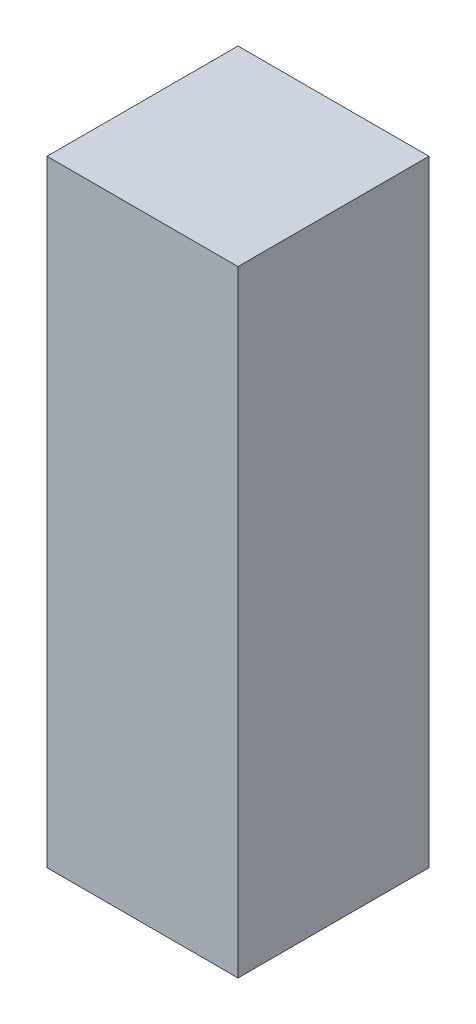
ISO-10303-21;
HEADER;
FILE_DESCRIPTION(('STEP AP214'),'2;1');
FILE_NAME('part.step','',(''),(''),'','','');
FILE_SCHEMA(('AUTOMOTIVE_DESIGN { 1 0 10303 214 1 1 1 1 }'));
ENDSEC;
DATA;
#1=APPLICATION_CONTEXT('core data for automotive mechanical design processes');
#2=APPLICATION_PROTOCOL_DEFINITION('international standard','automotive_design',2000,#1);
#3=PRODUCT_CONTEXT('',#1,'mechanical');
#4=PRODUCT('Part','Part','',(#3));
#5=PRODUCT_RELATED_PRODUCT_CATEGORY('part','',(#4));
#6=PRODUCT_DEFINITION_FORMATION('','',#4);
#7=PRODUCT_DEFINITION_CONTEXT('part definition',#1,'design');
#8=PRODUCT_DEFINITION('design','',#6,#7);
#9=PRODUCT_DEFINITION_SHAPE('','',#8);
#10=(LENGTH_UNIT() NAMED_UNIT(*) SI_UNIT(.MILLI.,.METRE.));
#11=(NAMED_UNIT(*) PLANE_ANGLE_UNIT() SI_UNIT($,.RADIAN.));
#12=(NAMED_UNIT(*) SI_UNIT($,.STERADIAN.) SOLID_ANGLE_UNIT());
#13=UNCERTAINTY_MEASURE_WITH_UNIT(LENGTH_MEASURE(1.E-05),#10,'distance_accuracy_value','');
#14=(GEOMETRIC_REPRESENTATION_CONTEXT(3) GLOBAL_UNCERTAINTY_ASSIGNED_CONTEXT((#13)) GLOBAL_UNIT_ASSIGNED_CONTEXT((#10,
#11,#12)) REPRESENTATION_CONTEXT('',''));
#15=CARTESIAN_POINT('',(0.,0.,0.));
#16=DIRECTION('',(0.,0.,1.));
#17=DIRECTION('',(1.,0.,0.));
#18=AXIS2_PLACEMENT_3D('',#15,#16,#17);
#19=CARTESIAN_POINT('',(31.,200.,-31.));
#20=DIRECTION('',(-1.,0.,0.));
#21=DIRECTION('',(0.,0.,1.));
#22=AXIS2_PLACEMENT_3D('',#19,#20,#21);
#23=PLANE('',#22);
#24=DIRECTION('',(0.,0.,-1.));
#25=VECTOR('',#24,1.);
#26=CARTESIAN_POINT('',(31.,0.,-31.));
#27=LINE('',#26,#25);
#28=CARTESIAN_POINT('',(31.,0.,31.));
#29=VERTEX_POINT('',#28);
#30=CARTESIAN_POINT('',(31.,0.,-31.));
#31=VERTEX_POINT('',#30);
#32=EDGE_CURVE('E100',#29,#31,#27,.T.);
#33=ORIENTED_EDGE('',*,*,#32,.T.);
#34=DIRECTION('',(0.,-1.,0.));
#35=VECTOR('',#34,1.);
#36=CARTESIAN_POINT('',(31.,200.,-31.));
#37=LINE('',#36,#35);
#38=CARTESIAN_POINT('',(31.,200.,-31.));
#39=VERTEX_POINT('',#38);
#40=EDGE_CURVE('E11',#39,#31,#37,.T.);
#41=ORIENTED_EDGE('',*,*,#40,.F.);
#42=DIRECTION('',(0.,0.,-1.));
#43=VECTOR('',#42,1.);
#44=CARTESIAN_POINT('',(31.,200.,-31.));
#45=LINE('',#44,#43);
#46=CARTESIAN_POINT('',(31.,200.,31.));
#47=VERTEX_POINT('',#46);
#48=EDGE_CURVE('E88',#47,#39,#45,.T.);
#49=ORIENTED_EDGE('',*,*,#48,.F.);
#50=DIRECTION('',(0.,-1.,0.));
#51=VECTOR('',#50,1.);
#52=CARTESIAN_POINT('',(31.,200.,31.));
#53=LINE('',#52,#51);
#54=EDGE_CURVE('E96',#47,#29,#53,.T.);
#55=ORIENTED_EDGE('',*,*,#54,.T.);
#56=EDGE_LOOP('',(#33,#41,#49,#55));
#57=FACE_BOUND('',#56,.T.);
#58=ADVANCED_FACE('F37',(#57),#23,.F.);
#59=CARTESIAN_POINT('',(-31.,200.,-31.));
#60=DIRECTION('',(0.,0.,1.));
#61=DIRECTION('',(1.,0.,0.));
#62=AXIS2_PLACEMENT_3D('',#59,#60,#61);
#63=PLANE('',#62);
#64=DIRECTION('',(-1.,0.,0.));
#65=VECTOR('',#64,1.);
#66=CARTESIAN_POINT('',(-31.,0.,-31.));
#67=LINE('',#66,#65);
#68=CARTESIAN_POINT('',(-31.,0.,-31.));
#69=VERTEX_POINT('',#68);
#70=EDGE_CURVE('E92',#31,#69,#67,.T.);
#71=ORIENTED_EDGE('',*,*,#70,.T.);
#72=DIRECTION('',(0.,-1.,0.));
#73=VECTOR('',#72,1.);
#74=CARTESIAN_POINT('',(-31.,200.,-31.));
#75=LINE('',#74,#73);
#76=CARTESIAN_POINT('',(-31.,200.,-31.));
#77=VERTEX_POINT('',#76);
#78=EDGE_CURVE('E45',#77,#69,#75,.T.);
#79=ORIENTED_EDGE('',*,*,#78,.F.);
#80=DIRECTION('',(-1.,0.,0.));
#81=VECTOR('',#80,1.);
#82=CARTESIAN_POINT('',(-31.,200.,-31.));
#83=LINE('',#82,#81);
#84=EDGE_CURVE('E83',#39,#77,#83,.T.);
#85=ORIENTED_EDGE('',*,*,#84,.F.);
#86=ORIENTED_EDGE('',*,*,#40,.T.);
#87=EDGE_LOOP('',(#71,#79,#85,#86));
#88=FACE_BOUND('',#87,.T.);
#89=ADVANCED_FACE('F91',(#88),#63,.F.);
#90=CARTESIAN_POINT('',(-31.,200.,-31.));
#91=DIRECTION('',(1.,0.,0.));
#92=DIRECTION('',(0.,0.,-1.));
#93=AXIS2_PLACEMENT_3D('',#90,#91,#92);
#94=PLANE('',#93);
#95=DIRECTION('',(0.,0.,1.));
#96=VECTOR('',#95,1.);
#97=CARTESIAN_POINT('',(-31.,0.,-31.));
#98=LINE('',#97,#96);
#99=CARTESIAN_POINT('',(-31.,0.,31.));
#100=VERTEX_POINT('',#99);
#101=EDGE_CURVE('E70',#69,#100,#98,.T.);
#102=ORIENTED_EDGE('',*,*,#101,.T.);
#103=DIRECTION('',(0.,-1.,0.));
#104=VECTOR('',#103,1.);
#105=CARTESIAN_POINT('',(-31.,200.,31.));
#106=LINE('',#105,#104);
#107=CARTESIAN_POINT('',(-31.,200.,31.));
#108=VERTEX_POINT('',#107);
#109=EDGE_CURVE('E93',#108,#100,#106,.T.);
#110=ORIENTED_EDGE('',*,*,#109,.F.);
#111=DIRECTION('',(0.,0.,1.));
#112=VECTOR('',#111,1.);
#113=CARTESIAN_POINT('',(-31.,200.,-31.));
#114=LINE('',#113,#112);
#115=EDGE_CURVE('E86',#77,#108,#114,.T.);
#116=ORIENTED_EDGE('',*,*,#115,.F.);
#117=ORIENTED_EDGE('',*,*,#78,.T.);
#118=EDGE_LOOP('',(#102,#110,#116,#117));
#119=FACE_BOUND('',#118,.T.);
#120=ADVANCED_FACE('F94',(#119),#94,.F.);
#121=CARTESIAN_POINT('',(-31.,200.,31.));
#122=DIRECTION('',(0.,0.,-1.));
#123=DIRECTION('',(-1.,0.,0.));
#124=AXIS2_PLACEMENT_3D('',#121,#122,#123);
#125=PLANE('',#124);
#126=DIRECTION('',(1.,0.,0.));
#127=VECTOR('',#126,1.);
#128=CARTESIAN_POINT('',(-31.,0.,31.));
#129=LINE('',#128,#127);
#130=EDGE_CURVE('E76',#100,#29,#129,.T.);
#131=ORIENTED_EDGE('',*,*,#130,.T.);
#132=ORIENTED_EDGE('',*,*,#54,.F.);
#133=DIRECTION('',(1.,0.,0.));
#134=VECTOR('',#133,1.);
#135=CARTESIAN_POINT('',(-31.,200.,31.));
#136=LINE('',#135,#134);
#137=EDGE_CURVE('E53',#108,#47,#136,.T.);
#138=ORIENTED_EDGE('',*,*,#137,.F.);
#139=ORIENTED_EDGE('',*,*,#109,.T.);
#140=EDGE_LOOP('',(#131,#132,#138,#139));
#141=FACE_BOUND('',#140,.T.);
#142=ADVANCED_FACE('F107',(#141),#125,.F.);
#143=CARTESIAN_POINT('',(0.,200.,0.));
#144=DIRECTION('',(0.,1.,0.));
#145=DIRECTION('',(0.,0.,1.));
#146=AXIS2_PLACEMENT_3D('',#143,#144,#145);
#147=PLANE('',#146);
#148=ORIENTED_EDGE('',*,*,#48,.T.);
#149=ORIENTED_EDGE('',*,*,#84,.T.);
#150=ORIENTED_EDGE('',*,*,#115,.T.);
#151=ORIENTED_EDGE('',*,*,#137,.T.);
#152=EDGE_LOOP('',(#148,#149,#150,#151));
#153=FACE_BOUND('',#152,.T.);
#154=ADVANCED_FACE('F84',(#153),#147,.T.);
#155=CARTESIAN_POINT('',(0.,0.,0.));
#156=DIRECTION('',(0.,1.,0.));
#157=DIRECTION('',(0.,0.,1.));
#158=AXIS2_PLACEMENT_3D('',#155,#156,#157);
#159=PLANE('',#158);
#160=ORIENTED_EDGE('',*,*,#32,.F.);
#161=ORIENTED_EDGE('',*,*,#130,.F.);
#162=ORIENTED_EDGE('',*,*,#101,.F.);
#163=ORIENTED_EDGE('',*,*,#70,.F.);
#164=EDGE_LOOP('',(#160,#161,#162,#163));
#165=FACE_BOUND('',#164,.T.);
#166=ADVANCED_FACE('F110',(#165),#159,.F.);
#167=CLOSED_SHELL('',(#58,#89,#120,#142,#154,#166));
#168=MANIFOLD_SOLID_BREP('B2',#167);
#169=ADVANCED_BREP_SHAPE_REPRESENTATION('',(#18,#168),#14);
#170=SHAPE_DEFINITION_REPRESENTATION(#9,#169);
ENDSEC;
END-ISO-10303-21;
